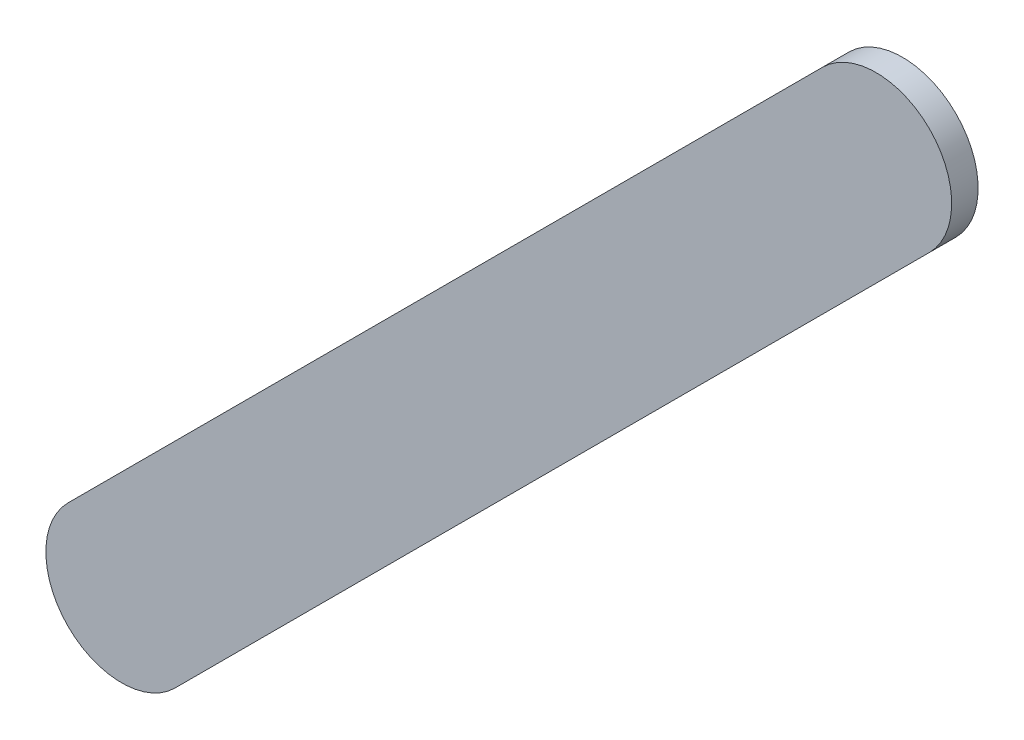
ISO-10303-21;
HEADER;
FILE_DESCRIPTION(('STEP AP214'),'2;1');
FILE_NAME('part.step','',(''),(''),'','','');
FILE_SCHEMA(('AUTOMOTIVE_DESIGN { 1 0 10303 214 1 1 1 1 }'));
ENDSEC;
DATA;
#1=APPLICATION_CONTEXT('core data for automotive mechanical design processes');
#2=APPLICATION_PROTOCOL_DEFINITION('international standard','automotive_design',2000,#1);
#3=PRODUCT_CONTEXT('',#1,'mechanical');
#4=PRODUCT('Part','Part','',(#3));
#5=PRODUCT_RELATED_PRODUCT_CATEGORY('part','',(#4));
#6=PRODUCT_DEFINITION_FORMATION('','',#4);
#7=PRODUCT_DEFINITION_CONTEXT('part definition',#1,'design');
#8=PRODUCT_DEFINITION('design','',#6,#7);
#9=PRODUCT_DEFINITION_SHAPE('','',#8);
#10=(LENGTH_UNIT() NAMED_UNIT(*) SI_UNIT(.MILLI.,.METRE.));
#11=(NAMED_UNIT(*) PLANE_ANGLE_UNIT() SI_UNIT($,.RADIAN.));
#12=(NAMED_UNIT(*) SI_UNIT($,.STERADIAN.) SOLID_ANGLE_UNIT());
#13=UNCERTAINTY_MEASURE_WITH_UNIT(LENGTH_MEASURE(1.E-05),#10,'distance_accuracy_value','');
#14=(GEOMETRIC_REPRESENTATION_CONTEXT(3) GLOBAL_UNCERTAINTY_ASSIGNED_CONTEXT((#13)) GLOBAL_UNIT_ASSIGNED_CONTEXT((#10,
#11,#12)) REPRESENTATION_CONTEXT('',''));
#15=CARTESIAN_POINT('',(0.,0.,0.));
#16=DIRECTION('',(0.,0.,1.));
#17=DIRECTION('',(1.,0.,0.));
#18=AXIS2_PLACEMENT_3D('',#15,#16,#17);
#19=CARTESIAN_POINT('',(88.81005,-129.07071,1.635));
#20=DIRECTION('',(0.,0.,1.));
#21=DIRECTION('',(1.,0.,0.));
#22=AXIS2_PLACEMENT_3D('',#19,#20,#21);
#23=PLANE('',#22);
#24=DIRECTION('',(0.707106781186548,0.707106781186548,0.));
#25=VECTOR('',#24,1.);
#26=CARTESIAN_POINT('',(88.81005,-129.07071,1.635));
#27=LINE('',#26,#25);
#28=CARTESIAN_POINT('',(88.81005,-129.07071,1.635));
#29=VERTEX_POINT('',#28);
#30=CARTESIAN_POINT('',(89.807968,-128.072792,1.635));
#31=VERTEX_POINT('',#30);
#32=EDGE_CURVE('E82',#29,#31,#27,.T.);
#33=ORIENTED_EDGE('',*,*,#32,.T.);
#34=CARTESIAN_POINT('',(89.7372575,-128.0020815,1.635));
#35=DIRECTION('',(0.,0.,1.));
#36=DIRECTION('',(0.707106781187047,-0.707106781186048,0.));
#37=AXIS2_PLACEMENT_3D('',#34,#35,#36);
#38=CIRCLE('',#37,0.09999974810219);
#39=CARTESIAN_POINT('',(89.666547,-127.931371,1.635));
#40=VERTEX_POINT('',#39);
#41=EDGE_CURVE('E98',#31,#40,#38,.T.);
#42=ORIENTED_EDGE('',*,*,#41,.T.);
#43=DIRECTION('',(-0.707106781186548,-0.707106781186548,0.));
#44=VECTOR('',#43,1.);
#45=CARTESIAN_POINT('',(89.666547,-127.931371,1.635));
#46=LINE('',#45,#44);
#47=CARTESIAN_POINT('',(88.668629,-128.929289,1.635));
#48=VERTEX_POINT('',#47);
#49=EDGE_CURVE('E75',#40,#48,#46,.T.);
#50=ORIENTED_EDGE('',*,*,#49,.T.);
#51=CARTESIAN_POINT('',(88.7393395,-128.9999995,1.635));
#52=DIRECTION('',(0.,0.,1.));
#53=DIRECTION('',(-0.707106781187048,0.707106781186048,0.));
#54=AXIS2_PLACEMENT_3D('',#51,#52,#53);
#55=CIRCLE('',#54,0.09999974810218);
#56=EDGE_CURVE('E11',#48,#29,#55,.T.);
#57=ORIENTED_EDGE('',*,*,#56,.T.);
#58=EDGE_LOOP('',(#33,#42,#50,#57));
#59=FACE_BOUND('',#58,.T.);
#60=ADVANCED_FACE('F17',(#59),#23,.T.);
#61=CARTESIAN_POINT('',(88.81005,-129.07071,1.6));
#62=DIRECTION('',(0.,0.,1.));
#63=DIRECTION('',(1.,0.,0.));
#64=AXIS2_PLACEMENT_3D('',#61,#62,#63);
#65=PLANE('',#64);
#66=CARTESIAN_POINT('',(88.7393395,-128.9999995,1.6));
#67=DIRECTION('',(0.,0.,1.));
#68=DIRECTION('',(-0.707106781187048,0.707106781186048,0.));
#69=AXIS2_PLACEMENT_3D('',#66,#67,#68);
#70=CIRCLE('',#69,0.09999974810218);
#71=CARTESIAN_POINT('',(88.668629,-128.929289,1.6));
#72=VERTEX_POINT('',#71);
#73=CARTESIAN_POINT('',(88.81005,-129.07071,1.6));
#74=VERTEX_POINT('',#73);
#75=EDGE_CURVE('E20',#72,#74,#70,.T.);
#76=ORIENTED_EDGE('',*,*,#75,.F.);
#77=DIRECTION('',(-0.707106781186548,-0.707106781186548,0.));
#78=VECTOR('',#77,1.);
#79=CARTESIAN_POINT('',(89.666547,-127.931371,1.6));
#80=LINE('',#79,#78);
#81=CARTESIAN_POINT('',(89.666547,-127.931371,1.6));
#82=VERTEX_POINT('',#81);
#83=EDGE_CURVE('E101',#82,#72,#80,.T.);
#84=ORIENTED_EDGE('',*,*,#83,.F.);
#85=CARTESIAN_POINT('',(89.7372575,-128.0020815,1.6));
#86=DIRECTION('',(0.,0.,1.));
#87=DIRECTION('',(0.707106781187047,-0.707106781186048,0.));
#88=AXIS2_PLACEMENT_3D('',#85,#86,#87);
#89=CIRCLE('',#88,0.09999974810219);
#90=CARTESIAN_POINT('',(89.807968,-128.072792,1.6));
#91=VERTEX_POINT('',#90);
#92=EDGE_CURVE('E84',#91,#82,#89,.T.);
#93=ORIENTED_EDGE('',*,*,#92,.F.);
#94=DIRECTION('',(0.707106781186548,0.707106781186548,0.));
#95=VECTOR('',#94,1.);
#96=CARTESIAN_POINT('',(88.81005,-129.07071,1.6));
#97=LINE('',#96,#95);
#98=EDGE_CURVE('E80',#74,#91,#97,.T.);
#99=ORIENTED_EDGE('',*,*,#98,.F.);
#100=EDGE_LOOP('',(#76,#84,#93,#99));
#101=FACE_BOUND('',#100,.T.);
#102=ADVANCED_FACE('F86',(#101),#65,.F.);
#103=CARTESIAN_POINT('',(88.7393395,-128.9999995,1.6));
#104=DIRECTION('',(0.,0.,-1.));
#105=DIRECTION('',(-0.707106781187048,0.707106781186048,0.));
#106=AXIS2_PLACEMENT_3D('',#103,#104,#105);
#107=CYLINDRICAL_SURFACE('',#106,0.09999974810218);
#108=ORIENTED_EDGE('',*,*,#75,.T.);
#109=DIRECTION('',(0.,0.,1.));
#110=VECTOR('',#109,1.);
#111=CARTESIAN_POINT('',(88.81005,-129.07071,1.6));
#112=LINE('',#111,#110);
#113=EDGE_CURVE('E69',#74,#29,#112,.T.);
#114=ORIENTED_EDGE('',*,*,#113,.T.);
#115=ORIENTED_EDGE('',*,*,#56,.F.);
#116=DIRECTION('',(0.,0.,1.));
#117=VECTOR('',#116,1.);
#118=CARTESIAN_POINT('',(88.668629,-128.929289,1.6));
#119=LINE('',#118,#117);
#120=EDGE_CURVE('E72',#72,#48,#119,.T.);
#121=ORIENTED_EDGE('',*,*,#120,.F.);
#122=EDGE_LOOP('',(#108,#114,#115,#121));
#123=FACE_BOUND('',#122,.T.);
#124=ADVANCED_FACE('F68',(#123),#107,.T.);
#125=CARTESIAN_POINT('',(89.666547,-127.931371,1.6));
#126=DIRECTION('',(0.707106781186548,-0.707106781186548,0.));
#127=DIRECTION('',(0.,0.,-1.));
#128=AXIS2_PLACEMENT_3D('',#125,#126,#127);
#129=PLANE('',#128);
#130=ORIENTED_EDGE('',*,*,#83,.T.);
#131=ORIENTED_EDGE('',*,*,#120,.T.);
#132=ORIENTED_EDGE('',*,*,#49,.F.);
#133=DIRECTION('',(0.,0.,1.));
#134=VECTOR('',#133,1.);
#135=CARTESIAN_POINT('',(89.666547,-127.931371,1.6));
#136=LINE('',#135,#134);
#137=EDGE_CURVE('E102',#82,#40,#136,.T.);
#138=ORIENTED_EDGE('',*,*,#137,.F.);
#139=EDGE_LOOP('',(#130,#131,#132,#138));
#140=FACE_BOUND('',#139,.T.);
#141=ADVANCED_FACE('F120',(#140),#129,.F.);
#142=CARTESIAN_POINT('',(89.7372575,-128.0020815,1.6));
#143=DIRECTION('',(0.,0.,-1.));
#144=DIRECTION('',(0.707106781187048,-0.707106781186048,0.));
#145=AXIS2_PLACEMENT_3D('',#142,#143,#144);
#146=CYLINDRICAL_SURFACE('',#145,0.09999974810219);
#147=ORIENTED_EDGE('',*,*,#92,.T.);
#148=ORIENTED_EDGE('',*,*,#137,.T.);
#149=ORIENTED_EDGE('',*,*,#41,.F.);
#150=DIRECTION('',(0.,0.,1.));
#151=VECTOR('',#150,1.);
#152=CARTESIAN_POINT('',(89.807968,-128.072792,1.6));
#153=LINE('',#152,#151);
#154=EDGE_CURVE('E90',#91,#31,#153,.T.);
#155=ORIENTED_EDGE('',*,*,#154,.F.);
#156=EDGE_LOOP('',(#147,#148,#149,#155));
#157=FACE_BOUND('',#156,.T.);
#158=ADVANCED_FACE('F122',(#157),#146,.T.);
#159=CARTESIAN_POINT('',(88.81005,-129.07071,1.6));
#160=DIRECTION('',(-0.707106781186548,0.707106781186548,0.));
#161=DIRECTION('',(0.,0.,1.));
#162=AXIS2_PLACEMENT_3D('',#159,#160,#161);
#163=PLANE('',#162);
#164=ORIENTED_EDGE('',*,*,#98,.T.);
#165=ORIENTED_EDGE('',*,*,#154,.T.);
#166=ORIENTED_EDGE('',*,*,#32,.F.);
#167=ORIENTED_EDGE('',*,*,#113,.F.);
#168=EDGE_LOOP('',(#164,#165,#166,#167));
#169=FACE_BOUND('',#168,.T.);
#170=ADVANCED_FACE('F78',(#169),#163,.F.);
#171=CLOSED_SHELL('',(#60,#102,#124,#141,#158,#170));
#172=MANIFOLD_SOLID_BREP('B1',#171);
#173=ADVANCED_BREP_SHAPE_REPRESENTATION('',(#18,#172),#14);
#174=SHAPE_DEFINITION_REPRESENTATION(#9,#173);
ENDSEC;
END-ISO-10303-21;
